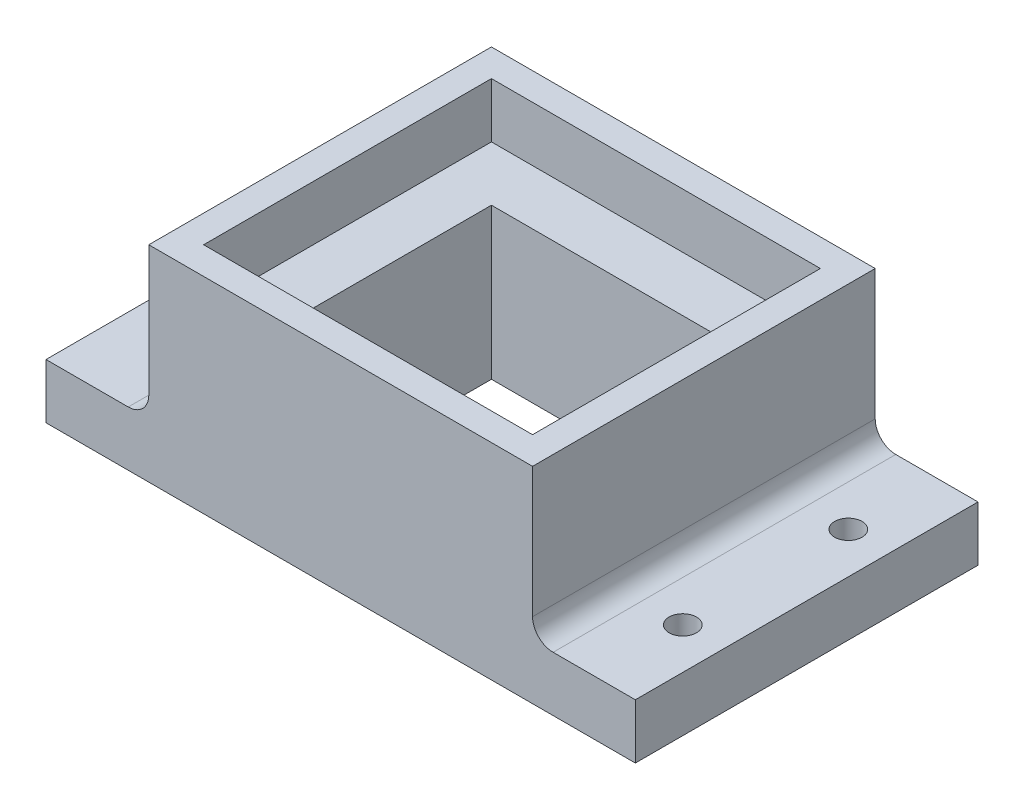
ISO-10303-21;
HEADER;
FILE_DESCRIPTION(('STEP AP214'),'2;1');
FILE_NAME('part.step','',(''),(''),'','','');
FILE_SCHEMA(('AUTOMOTIVE_DESIGN { 1 0 10303 214 1 1 1 1 }'));
ENDSEC;
DATA;
#1=APPLICATION_CONTEXT('core data for automotive mechanical design processes');
#2=APPLICATION_PROTOCOL_DEFINITION('international standard','automotive_design',2000,#1);
#3=PRODUCT_CONTEXT('',#1,'mechanical');
#4=PRODUCT('Part','Part','',(#3));
#5=PRODUCT_RELATED_PRODUCT_CATEGORY('part','',(#4));
#6=PRODUCT_DEFINITION_FORMATION('','',#4);
#7=PRODUCT_DEFINITION_CONTEXT('part definition',#1,'design');
#8=PRODUCT_DEFINITION('design','',#6,#7);
#9=PRODUCT_DEFINITION_SHAPE('','',#8);
#10=(LENGTH_UNIT() NAMED_UNIT(*) SI_UNIT(.MILLI.,.METRE.));
#11=(NAMED_UNIT(*) PLANE_ANGLE_UNIT() SI_UNIT($,.RADIAN.));
#12=(NAMED_UNIT(*) SI_UNIT($,.STERADIAN.) SOLID_ANGLE_UNIT());
#13=UNCERTAINTY_MEASURE_WITH_UNIT(LENGTH_MEASURE(1.E-05),#10,'distance_accuracy_value','');
#14=(GEOMETRIC_REPRESENTATION_CONTEXT(3) GLOBAL_UNCERTAINTY_ASSIGNED_CONTEXT((#13)) GLOBAL_UNIT_ASSIGNED_CONTEXT((#10,
#11,#12)) REPRESENTATION_CONTEXT('',''));
#15=CARTESIAN_POINT('',(0.,0.,0.));
#16=DIRECTION('',(0.,0.,1.));
#17=DIRECTION('',(1.,0.,0.));
#18=AXIS2_PLACEMENT_3D('',#15,#16,#17);
#19=CARTESIAN_POINT('',(28.,30.,25.));
#20=DIRECTION('',(-1.,0.,0.));
#21=DIRECTION('',(0.,0.,1.));
#22=AXIS2_PLACEMENT_3D('',#19,#20,#21);
#23=PLANE('',#22);
#24=DIRECTION('',(0.,-1.,0.));
#25=VECTOR('',#24,1.);
#26=CARTESIAN_POINT('',(28.,30.,25.));
#27=LINE('',#26,#25);
#28=CARTESIAN_POINT('',(28.,30.,25.));
#29=VERTEX_POINT('',#28);
#30=CARTESIAN_POINT('',(28.,11.,25.));
#31=VERTEX_POINT('',#30);
#32=EDGE_CURVE('E273',#29,#31,#27,.T.);
#33=ORIENTED_EDGE('',*,*,#32,.T.);
#34=DIRECTION('',(0.,0.,1.));
#35=VECTOR('',#34,1.);
#36=CARTESIAN_POINT('',(28.,11.,25.));
#37=LINE('',#36,#35);
#38=CARTESIAN_POINT('',(28.,11.,-25.));
#39=VERTEX_POINT('',#38);
#40=EDGE_CURVE('E290',#31,#39,#37,.F.);
#41=ORIENTED_EDGE('',*,*,#40,.T.);
#42=DIRECTION('',(0.,-1.,0.));
#43=VECTOR('',#42,1.);
#44=CARTESIAN_POINT('',(28.,30.,-25.));
#45=LINE('',#44,#43);
#46=CARTESIAN_POINT('',(28.,30.,-25.));
#47=VERTEX_POINT('',#46);
#48=EDGE_CURVE('E284',#47,#39,#45,.T.);
#49=ORIENTED_EDGE('',*,*,#48,.F.);
#50=DIRECTION('',(0.,0.,-1.));
#51=VECTOR('',#50,1.);
#52=CARTESIAN_POINT('',(28.,30.,25.));
#53=LINE('',#52,#51);
#54=EDGE_CURVE('E263',#29,#47,#53,.T.);
#55=ORIENTED_EDGE('',*,*,#54,.F.);
#56=EDGE_LOOP('',(#33,#41,#49,#55));
#57=FACE_BOUND('',#56,.T.);
#58=ADVANCED_FACE('F41',(#57),#23,.F.);
#59=CARTESIAN_POINT('',(-28.,30.,-25.));
#60=DIRECTION('',(0.,0.,1.));
#61=DIRECTION('',(1.,0.,0.));
#62=AXIS2_PLACEMENT_3D('',#59,#60,#61);
#63=PLANE('',#62);
#64=DIRECTION('',(-1.,0.,0.));
#65=VECTOR('',#64,1.);
#66=CARTESIAN_POINT('',(-28.,0.,-25.));
#67=LINE('',#66,#65);
#68=CARTESIAN_POINT('',(43.,0.,-25.));
#69=VERTEX_POINT('',#68);
#70=CARTESIAN_POINT('',(-43.,0.,-25.));
#71=VERTEX_POINT('',#70);
#72=EDGE_CURVE('E256',#69,#71,#67,.T.);
#73=ORIENTED_EDGE('',*,*,#72,.T.);
#74=DIRECTION('',(0.,1.,0.));
#75=VECTOR('',#74,1.);
#76=CARTESIAN_POINT('',(-43.,0.,-25.));
#77=LINE('',#76,#75);
#78=CARTESIAN_POINT('',(-43.,8.,-25.));
#79=VERTEX_POINT('',#78);
#80=EDGE_CURVE('E215',#71,#79,#77,.T.);
#81=ORIENTED_EDGE('',*,*,#80,.T.);
#82=DIRECTION('',(1.,0.,0.));
#83=VECTOR('',#82,1.);
#84=CARTESIAN_POINT('',(-28.,8.,-25.));
#85=LINE('',#84,#83);
#86=CARTESIAN_POINT('',(-31.,8.,-25.));
#87=VERTEX_POINT('',#86);
#88=EDGE_CURVE('E217',#79,#87,#85,.T.);
#89=ORIENTED_EDGE('',*,*,#88,.T.);
#90=CARTESIAN_POINT('',(-31.,11.,-25.));
#91=DIRECTION('',(0.,0.,1.));
#92=DIRECTION('',(1.,0.,0.));
#93=AXIS2_PLACEMENT_3D('',#90,#91,#92);
#94=CIRCLE('',#93,3.);
#95=CARTESIAN_POINT('',(-28.,11.,-25.));
#96=VERTEX_POINT('',#95);
#97=EDGE_CURVE('E303',#87,#96,#94,.T.);
#98=ORIENTED_EDGE('',*,*,#97,.T.);
#99=DIRECTION('',(0.,-1.,0.));
#100=VECTOR('',#99,1.);
#101=CARTESIAN_POINT('',(-28.,30.,-25.));
#102=LINE('',#101,#100);
#103=CARTESIAN_POINT('',(-28.,30.,-25.));
#104=VERTEX_POINT('',#103);
#105=EDGE_CURVE('E281',#104,#96,#102,.T.);
#106=ORIENTED_EDGE('',*,*,#105,.F.);
#107=DIRECTION('',(-1.,0.,0.));
#108=VECTOR('',#107,1.);
#109=CARTESIAN_POINT('',(-28.,30.,-25.));
#110=LINE('',#109,#108);
#111=EDGE_CURVE('E266',#47,#104,#110,.T.);
#112=ORIENTED_EDGE('',*,*,#111,.F.);
#113=ORIENTED_EDGE('',*,*,#48,.T.);
#114=CARTESIAN_POINT('',(31.,11.,-25.));
#115=DIRECTION('',(0.,0.,1.));
#116=DIRECTION('',(1.,0.,0.));
#117=AXIS2_PLACEMENT_3D('',#114,#115,#116);
#118=CIRCLE('',#117,3.);
#119=CARTESIAN_POINT('',(31.,8.00000000000001,-25.));
#120=VERTEX_POINT('',#119);
#121=EDGE_CURVE('E299',#39,#120,#118,.T.);
#122=ORIENTED_EDGE('',*,*,#121,.T.);
#123=DIRECTION('',(1.,0.,0.));
#124=VECTOR('',#123,1.);
#125=CARTESIAN_POINT('',(28.,8.00000000000001,-25.));
#126=LINE('',#125,#124);
#127=CARTESIAN_POINT('',(43.,8.00000000000001,-25.));
#128=VERTEX_POINT('',#127);
#129=EDGE_CURVE('E194',#120,#128,#126,.T.);
#130=ORIENTED_EDGE('',*,*,#129,.T.);
#131=DIRECTION('',(0.,-1.,0.));
#132=VECTOR('',#131,1.);
#133=CARTESIAN_POINT('',(43.,0.,-25.));
#134=LINE('',#133,#132);
#135=EDGE_CURVE('E205',#128,#69,#134,.T.);
#136=ORIENTED_EDGE('',*,*,#135,.T.);
#137=EDGE_LOOP('',(#73,#81,#89,#98,#106,#112,#113,#122,#130,#136));
#138=FACE_BOUND('',#137,.T.);
#139=ADVANCED_FACE('F326',(#138),#63,.F.);
#140=CARTESIAN_POINT('',(-28.,30.,25.));
#141=DIRECTION('',(1.,0.,0.));
#142=DIRECTION('',(0.,0.,-1.));
#143=AXIS2_PLACEMENT_3D('',#140,#141,#142);
#144=PLANE('',#143);
#145=ORIENTED_EDGE('',*,*,#105,.T.);
#146=DIRECTION('',(0.,0.,1.));
#147=VECTOR('',#146,1.);
#148=CARTESIAN_POINT('',(-28.,11.,25.));
#149=LINE('',#148,#147);
#150=CARTESIAN_POINT('',(-28.,11.,25.));
#151=VERTEX_POINT('',#150);
#152=EDGE_CURVE('E292',#96,#151,#149,.T.);
#153=ORIENTED_EDGE('',*,*,#152,.T.);
#154=DIRECTION('',(0.,-1.,0.));
#155=VECTOR('',#154,1.);
#156=CARTESIAN_POINT('',(-28.,30.,25.));
#157=LINE('',#156,#155);
#158=CARTESIAN_POINT('',(-28.,30.,25.));
#159=VERTEX_POINT('',#158);
#160=EDGE_CURVE('E278',#159,#151,#157,.T.);
#161=ORIENTED_EDGE('',*,*,#160,.F.);
#162=DIRECTION('',(0.,0.,1.));
#163=VECTOR('',#162,1.);
#164=CARTESIAN_POINT('',(-28.,30.,25.));
#165=LINE('',#164,#163);
#166=EDGE_CURVE('E269',#104,#159,#165,.T.);
#167=ORIENTED_EDGE('',*,*,#166,.F.);
#168=EDGE_LOOP('',(#145,#153,#161,#167));
#169=FACE_BOUND('',#168,.T.);
#170=ADVANCED_FACE('F332',(#169),#144,.F.);
#171=CARTESIAN_POINT('',(-28.,30.,25.));
#172=DIRECTION('',(0.,0.,-1.));
#173=DIRECTION('',(-1.,0.,0.));
#174=AXIS2_PLACEMENT_3D('',#171,#172,#173);
#175=PLANE('',#174);
#176=DIRECTION('',(1.,0.,0.));
#177=VECTOR('',#176,1.);
#178=CARTESIAN_POINT('',(-28.,0.,25.));
#179=LINE('',#178,#177);
#180=CARTESIAN_POINT('',(-43.,0.,25.));
#181=VERTEX_POINT('',#180);
#182=CARTESIAN_POINT('',(43.,0.,25.));
#183=VERTEX_POINT('',#182);
#184=EDGE_CURVE('E267',#181,#183,#179,.T.);
#185=ORIENTED_EDGE('',*,*,#184,.T.);
#186=DIRECTION('',(0.,1.,0.));
#187=VECTOR('',#186,1.);
#188=CARTESIAN_POINT('',(43.,0.,25.));
#189=LINE('',#188,#187);
#190=CARTESIAN_POINT('',(43.,8.00000000000001,25.));
#191=VERTEX_POINT('',#190);
#192=EDGE_CURVE('E208',#183,#191,#189,.T.);
#193=ORIENTED_EDGE('',*,*,#192,.T.);
#194=DIRECTION('',(-1.,0.,0.));
#195=VECTOR('',#194,1.);
#196=CARTESIAN_POINT('',(28.,8.00000000000001,25.));
#197=LINE('',#196,#195);
#198=CARTESIAN_POINT('',(31.,8.00000000000001,25.));
#199=VERTEX_POINT('',#198);
#200=EDGE_CURVE('E202',#191,#199,#197,.T.);
#201=ORIENTED_EDGE('',*,*,#200,.T.);
#202=CARTESIAN_POINT('',(31.,11.,25.));
#203=DIRECTION('',(0.,0.,-1.));
#204=DIRECTION('',(-1.,0.,0.));
#205=AXIS2_PLACEMENT_3D('',#202,#203,#204);
#206=CIRCLE('',#205,3.);
#207=EDGE_CURVE('E297',#199,#31,#206,.T.);
#208=ORIENTED_EDGE('',*,*,#207,.T.);
#209=ORIENTED_EDGE('',*,*,#32,.F.);
#210=DIRECTION('',(1.,0.,0.));
#211=VECTOR('',#210,1.);
#212=CARTESIAN_POINT('',(-28.,30.,25.));
#213=LINE('',#212,#211);
#214=EDGE_CURVE('E271',#159,#29,#213,.T.);
#215=ORIENTED_EDGE('',*,*,#214,.F.);
#216=ORIENTED_EDGE('',*,*,#160,.T.);
#217=CARTESIAN_POINT('',(-31.,11.,25.));
#218=DIRECTION('',(0.,0.,-1.));
#219=DIRECTION('',(-1.,0.,0.));
#220=AXIS2_PLACEMENT_3D('',#217,#218,#219);
#221=CIRCLE('',#220,3.);
#222=CARTESIAN_POINT('',(-31.,8.,25.));
#223=VERTEX_POINT('',#222);
#224=EDGE_CURVE('E301',#151,#223,#221,.T.);
#225=ORIENTED_EDGE('',*,*,#224,.T.);
#226=DIRECTION('',(-1.,0.,0.));
#227=VECTOR('',#226,1.);
#228=CARTESIAN_POINT('',(-28.,8.,25.));
#229=LINE('',#228,#227);
#230=CARTESIAN_POINT('',(-43.,8.,25.));
#231=VERTEX_POINT('',#230);
#232=EDGE_CURVE('E211',#223,#231,#229,.T.);
#233=ORIENTED_EDGE('',*,*,#232,.T.);
#234=DIRECTION('',(0.,-1.,0.));
#235=VECTOR('',#234,1.);
#236=CARTESIAN_POINT('',(-43.,0.,25.));
#237=LINE('',#236,#235);
#238=EDGE_CURVE('E220',#231,#181,#237,.T.);
#239=ORIENTED_EDGE('',*,*,#238,.T.);
#240=EDGE_LOOP('',(#185,#193,#201,#208,#209,#215,#216,#225,#233,#239));
#241=FACE_BOUND('',#240,.T.);
#242=ADVANCED_FACE('F360',(#241),#175,.F.);
#243=CARTESIAN_POINT('',(0.,30.,0.));
#244=DIRECTION('',(0.,-1.,0.));
#245=DIRECTION('',(0.,0.,-1.));
#246=AXIS2_PLACEMENT_3D('',#243,#244,#245);
#247=PLANE('',#246);
#248=DIRECTION('',(-1.,0.,0.));
#249=VECTOR('',#248,1.);
#250=CARTESIAN_POINT('',(-24.,30.,-21.));
#251=LINE('',#250,#249);
#252=CARTESIAN_POINT('',(24.,30.,-21.));
#253=VERTEX_POINT('',#252);
#254=CARTESIAN_POINT('',(-24.,30.,-21.));
#255=VERTEX_POINT('',#254);
#256=EDGE_CURVE('E246',#253,#255,#251,.T.);
#257=ORIENTED_EDGE('',*,*,#256,.F.);
#258=DIRECTION('',(0.,0.,-1.));
#259=VECTOR('',#258,1.);
#260=CARTESIAN_POINT('',(24.,30.,21.));
#261=LINE('',#260,#259);
#262=CARTESIAN_POINT('',(24.,30.,21.));
#263=VERTEX_POINT('',#262);
#264=EDGE_CURVE('E230',#263,#253,#261,.T.);
#265=ORIENTED_EDGE('',*,*,#264,.F.);
#266=DIRECTION('',(1.,0.,0.));
#267=VECTOR('',#266,1.);
#268=CARTESIAN_POINT('',(-24.,30.,21.));
#269=LINE('',#268,#267);
#270=CARTESIAN_POINT('',(-24.,30.,21.));
#271=VERTEX_POINT('',#270);
#272=EDGE_CURVE('E235',#271,#263,#269,.T.);
#273=ORIENTED_EDGE('',*,*,#272,.F.);
#274=DIRECTION('',(0.,0.,1.));
#275=VECTOR('',#274,1.);
#276=CARTESIAN_POINT('',(-24.,30.,21.));
#277=LINE('',#276,#275);
#278=EDGE_CURVE('E249',#255,#271,#277,.T.);
#279=ORIENTED_EDGE('',*,*,#278,.F.);
#280=EDGE_LOOP('',(#257,#265,#273,#279));
#281=FACE_BOUND('',#280,.T.);
#282=ORIENTED_EDGE('',*,*,#54,.T.);
#283=ORIENTED_EDGE('',*,*,#111,.T.);
#284=ORIENTED_EDGE('',*,*,#166,.T.);
#285=ORIENTED_EDGE('',*,*,#214,.T.);
#286=EDGE_LOOP('',(#282,#283,#284,#285));
#287=FACE_BOUND('',#286,.T.);
#288=ADVANCED_FACE('F382',(#281,#287),#247,.F.);
#289=CARTESIAN_POINT('',(0.,0.,0.));
#290=DIRECTION('',(0.,-1.,0.));
#291=DIRECTION('',(0.,0.,-1.));
#292=AXIS2_PLACEMENT_3D('',#289,#290,#291);
#293=PLANE('',#292);
#294=CARTESIAN_POINT('',(37.,0.,-12.0793859622358));
#295=DIRECTION('',(0.,1.,0.));
#296=DIRECTION('',(1.,0.,0.));
#297=AXIS2_PLACEMENT_3D('',#294,#295,#296);
#298=CIRCLE('',#297,2.);
#299=CARTESIAN_POINT('',(39.,0.,-12.0793859622358));
#300=VERTEX_POINT('',#299);
#301=EDGE_CURVE('E675',#300,#300,#298,.T.);
#302=ORIENTED_EDGE('',*,*,#301,.T.);
#303=EDGE_LOOP('',(#302));
#304=FACE_BOUND('',#303,.T.);
#305=CARTESIAN_POINT('',(37.,0.,12.0793859622358));
#306=DIRECTION('',(0.,1.,0.));
#307=DIRECTION('',(1.,0.,0.));
#308=AXIS2_PLACEMENT_3D('',#305,#306,#307);
#309=CIRCLE('',#308,2.);
#310=CARTESIAN_POINT('',(39.,0.,12.0793859622358));
#311=VERTEX_POINT('',#310);
#312=EDGE_CURVE('E669',#311,#311,#309,.T.);
#313=ORIENTED_EDGE('',*,*,#312,.T.);
#314=EDGE_LOOP('',(#313));
#315=FACE_BOUND('',#314,.T.);
#316=CARTESIAN_POINT('',(-37.,0.,12.0793859622358));
#317=DIRECTION('',(0.,1.,0.));
#318=DIRECTION('',(-1.,0.,0.));
#319=AXIS2_PLACEMENT_3D('',#316,#317,#318);
#320=CIRCLE('',#319,2.);
#321=CARTESIAN_POINT('',(-39.,0.,12.0793859622358));
#322=VERTEX_POINT('',#321);
#323=EDGE_CURVE('E658',#322,#322,#320,.T.);
#324=ORIENTED_EDGE('',*,*,#323,.T.);
#325=EDGE_LOOP('',(#324));
#326=FACE_BOUND('',#325,.T.);
#327=CARTESIAN_POINT('',(-37.,0.,-12.0793859622358));
#328=DIRECTION('',(0.,1.,0.));
#329=DIRECTION('',(-1.,0.,0.));
#330=AXIS2_PLACEMENT_3D('',#327,#328,#329);
#331=CIRCLE('',#330,2.);
#332=CARTESIAN_POINT('',(-39.,0.,-12.0793859622358));
#333=VERTEX_POINT('',#332);
#334=EDGE_CURVE('E183',#333,#333,#331,.T.);
#335=ORIENTED_EDGE('',*,*,#334,.T.);
#336=EDGE_LOOP('',(#335));
#337=FACE_BOUND('',#336,.T.);
#338=DIRECTION('',(0.,0.,-1.));
#339=VECTOR('',#338,1.);
#340=CARTESIAN_POINT('',(16.,0.,13.));
#341=LINE('',#340,#339);
#342=CARTESIAN_POINT('',(16.,0.,13.));
#343=VERTEX_POINT('',#342);
#344=CARTESIAN_POINT('',(16.,0.,-13.));
#345=VERTEX_POINT('',#344);
#346=EDGE_CURVE('E169',#343,#345,#341,.T.);
#347=ORIENTED_EDGE('',*,*,#346,.T.);
#348=DIRECTION('',(-1.,0.,0.));
#349=VECTOR('',#348,1.);
#350=CARTESIAN_POINT('',(-16.,0.,-13.));
#351=LINE('',#350,#349);
#352=CARTESIAN_POINT('',(-16.,0.,-13.));
#353=VERTEX_POINT('',#352);
#354=EDGE_CURVE('E176',#345,#353,#351,.T.);
#355=ORIENTED_EDGE('',*,*,#354,.T.);
#356=DIRECTION('',(0.,0.,1.));
#357=VECTOR('',#356,1.);
#358=CARTESIAN_POINT('',(-16.,0.,13.));
#359=LINE('',#358,#357);
#360=CARTESIAN_POINT('',(-16.,0.,13.));
#361=VERTEX_POINT('',#360);
#362=EDGE_CURVE('E56',#353,#361,#359,.T.);
#363=ORIENTED_EDGE('',*,*,#362,.T.);
#364=DIRECTION('',(1.,0.,0.));
#365=VECTOR('',#364,1.);
#366=CARTESIAN_POINT('',(-16.,0.,13.));
#367=LINE('',#366,#365);
#368=EDGE_CURVE('E173',#361,#343,#367,.T.);
#369=ORIENTED_EDGE('',*,*,#368,.T.);
#370=EDGE_LOOP('',(#347,#355,#363,#369));
#371=FACE_BOUND('',#370,.T.);
#372=ORIENTED_EDGE('',*,*,#72,.F.);
#373=DIRECTION('',(0.,0.,1.));
#374=VECTOR('',#373,1.);
#375=CARTESIAN_POINT('',(43.,0.,-42.));
#376=LINE('',#375,#374);
#377=EDGE_CURVE('E199',#69,#183,#376,.T.);
#378=ORIENTED_EDGE('',*,*,#377,.T.);
#379=ORIENTED_EDGE('',*,*,#184,.F.);
#380=DIRECTION('',(0.,0.,1.));
#381=VECTOR('',#380,1.);
#382=CARTESIAN_POINT('',(-43.,0.,-42.));
#383=LINE('',#382,#381);
#384=EDGE_CURVE('E218',#71,#181,#383,.T.);
#385=ORIENTED_EDGE('',*,*,#384,.F.);
#386=EDGE_LOOP('',(#372,#378,#379,#385));
#387=FACE_BOUND('',#386,.T.);
#388=ADVANCED_FACE('F180',(#304,#315,#326,#337,#371,#387),#293,.T.);
#389=CARTESIAN_POINT('',(24.,22.,21.));
#390=DIRECTION('',(1.,0.,0.));
#391=DIRECTION('',(0.,0.,-1.));
#392=AXIS2_PLACEMENT_3D('',#389,#390,#391);
#393=PLANE('',#392);
#394=ORIENTED_EDGE('',*,*,#264,.T.);
#395=DIRECTION('',(0.,1.,0.));
#396=VECTOR('',#395,1.);
#397=CARTESIAN_POINT('',(24.,22.,-21.));
#398=LINE('',#397,#396);
#399=CARTESIAN_POINT('',(24.,22.,-21.));
#400=VERTEX_POINT('',#399);
#401=EDGE_CURVE('E244',#400,#253,#398,.T.);
#402=ORIENTED_EDGE('',*,*,#401,.F.);
#403=DIRECTION('',(0.,0.,-1.));
#404=VECTOR('',#403,1.);
#405=CARTESIAN_POINT('',(24.,22.,21.));
#406=LINE('',#405,#404);
#407=CARTESIAN_POINT('',(24.,22.,21.));
#408=VERTEX_POINT('',#407);
#409=EDGE_CURVE('E231',#408,#400,#406,.T.);
#410=ORIENTED_EDGE('',*,*,#409,.F.);
#411=DIRECTION('',(0.,1.,0.));
#412=VECTOR('',#411,1.);
#413=CARTESIAN_POINT('',(24.,22.,21.));
#414=LINE('',#413,#412);
#415=EDGE_CURVE('E254',#408,#263,#414,.T.);
#416=ORIENTED_EDGE('',*,*,#415,.T.);
#417=EDGE_LOOP('',(#394,#402,#410,#416));
#418=FACE_BOUND('',#417,.T.);
#419=ADVANCED_FACE('F390',(#418),#393,.F.);
#420=CARTESIAN_POINT('',(-24.,22.,21.));
#421=DIRECTION('',(0.,0.,1.));
#422=DIRECTION('',(1.,0.,0.));
#423=AXIS2_PLACEMENT_3D('',#420,#421,#422);
#424=PLANE('',#423);
#425=ORIENTED_EDGE('',*,*,#272,.T.);
#426=ORIENTED_EDGE('',*,*,#415,.F.);
#427=DIRECTION('',(1.,0.,0.));
#428=VECTOR('',#427,1.);
#429=CARTESIAN_POINT('',(-24.,22.,21.));
#430=LINE('',#429,#428);
#431=CARTESIAN_POINT('',(-24.,22.,21.));
#432=VERTEX_POINT('',#431);
#433=EDGE_CURVE('E241',#432,#408,#430,.T.);
#434=ORIENTED_EDGE('',*,*,#433,.F.);
#435=DIRECTION('',(0.,1.,0.));
#436=VECTOR('',#435,1.);
#437=CARTESIAN_POINT('',(-24.,22.,21.));
#438=LINE('',#437,#436);
#439=EDGE_CURVE('E257',#432,#271,#438,.T.);
#440=ORIENTED_EDGE('',*,*,#439,.T.);
#441=EDGE_LOOP('',(#425,#426,#434,#440));
#442=FACE_BOUND('',#441,.T.);
#443=ADVANCED_FACE('F580',(#442),#424,.F.);
#444=CARTESIAN_POINT('',(-24.,22.,21.));
#445=DIRECTION('',(-1.,0.,0.));
#446=DIRECTION('',(0.,0.,1.));
#447=AXIS2_PLACEMENT_3D('',#444,#445,#446);
#448=PLANE('',#447);
#449=ORIENTED_EDGE('',*,*,#278,.T.);
#450=ORIENTED_EDGE('',*,*,#439,.F.);
#451=DIRECTION('',(0.,0.,1.));
#452=VECTOR('',#451,1.);
#453=CARTESIAN_POINT('',(-24.,22.,21.));
#454=LINE('',#453,#452);
#455=CARTESIAN_POINT('',(-24.,22.,-21.));
#456=VERTEX_POINT('',#455);
#457=EDGE_CURVE('E238',#456,#432,#454,.T.);
#458=ORIENTED_EDGE('',*,*,#457,.F.);
#459=DIRECTION('',(0.,1.,0.));
#460=VECTOR('',#459,1.);
#461=CARTESIAN_POINT('',(-24.,22.,-21.));
#462=LINE('',#461,#460);
#463=EDGE_CURVE('E259',#456,#255,#462,.T.);
#464=ORIENTED_EDGE('',*,*,#463,.T.);
#465=EDGE_LOOP('',(#449,#450,#458,#464));
#466=FACE_BOUND('',#465,.T.);
#467=ADVANCED_FACE('F571',(#466),#448,.F.);
#468=CARTESIAN_POINT('',(-24.,22.,-21.));
#469=DIRECTION('',(0.,0.,-1.));
#470=DIRECTION('',(-1.,0.,0.));
#471=AXIS2_PLACEMENT_3D('',#468,#469,#470);
#472=PLANE('',#471);
#473=ORIENTED_EDGE('',*,*,#256,.T.);
#474=ORIENTED_EDGE('',*,*,#463,.F.);
#475=DIRECTION('',(-1.,0.,0.));
#476=VECTOR('',#475,1.);
#477=CARTESIAN_POINT('',(-24.,22.,-21.));
#478=LINE('',#477,#476);
#479=EDGE_CURVE('E234',#400,#456,#478,.T.);
#480=ORIENTED_EDGE('',*,*,#479,.F.);
#481=ORIENTED_EDGE('',*,*,#401,.T.);
#482=EDGE_LOOP('',(#473,#474,#480,#481));
#483=FACE_BOUND('',#482,.T.);
#484=ADVANCED_FACE('F432',(#483),#472,.F.);
#485=CARTESIAN_POINT('',(0.,22.,0.));
#486=DIRECTION('',(0.,-1.,0.));
#487=DIRECTION('',(0.,0.,-1.));
#488=AXIS2_PLACEMENT_3D('',#485,#486,#487);
#489=PLANE('',#488);
#490=DIRECTION('',(1.,0.,0.));
#491=VECTOR('',#490,1.);
#492=CARTESIAN_POINT('',(0.,22.,-13.));
#493=LINE('',#492,#491);
#494=CARTESIAN_POINT('',(-16.,22.,-13.));
#495=VERTEX_POINT('',#494);
#496=CARTESIAN_POINT('',(16.,22.,-13.));
#497=VERTEX_POINT('',#496);
#498=EDGE_CURVE('E305',#495,#497,#493,.T.);
#499=ORIENTED_EDGE('',*,*,#498,.T.);
#500=DIRECTION('',(0.,0.,1.));
#501=VECTOR('',#500,1.);
#502=CARTESIAN_POINT('',(16.,22.,0.));
#503=LINE('',#502,#501);
#504=CARTESIAN_POINT('',(16.,22.,13.));
#505=VERTEX_POINT('',#504);
#506=EDGE_CURVE('E11',#497,#505,#503,.T.);
#507=ORIENTED_EDGE('',*,*,#506,.T.);
#508=DIRECTION('',(-1.,0.,0.));
#509=VECTOR('',#508,1.);
#510=CARTESIAN_POINT('',(0.,22.,13.));
#511=LINE('',#510,#509);
#512=CARTESIAN_POINT('',(-16.,22.,13.));
#513=VERTEX_POINT('',#512);
#514=EDGE_CURVE('E49',#505,#513,#511,.T.);
#515=ORIENTED_EDGE('',*,*,#514,.T.);
#516=DIRECTION('',(0.,0.,-1.));
#517=VECTOR('',#516,1.);
#518=CARTESIAN_POINT('',(-16.,22.,0.));
#519=LINE('',#518,#517);
#520=EDGE_CURVE('E307',#513,#495,#519,.T.);
#521=ORIENTED_EDGE('',*,*,#520,.T.);
#522=EDGE_LOOP('',(#499,#507,#515,#521));
#523=FACE_BOUND('',#522,.T.);
#524=ORIENTED_EDGE('',*,*,#409,.T.);
#525=ORIENTED_EDGE('',*,*,#479,.T.);
#526=ORIENTED_EDGE('',*,*,#457,.T.);
#527=ORIENTED_EDGE('',*,*,#433,.T.);
#528=EDGE_LOOP('',(#524,#525,#526,#527));
#529=FACE_BOUND('',#528,.T.);
#530=ADVANCED_FACE('F311',(#523,#529),#489,.F.);
#531=CARTESIAN_POINT('',(-43.,0.,-42.));
#532=DIRECTION('',(-1.,0.,0.));
#533=DIRECTION('',(0.,0.,1.));
#534=AXIS2_PLACEMENT_3D('',#531,#532,#533);
#535=PLANE('',#534);
#536=ORIENTED_EDGE('',*,*,#80,.F.);
#537=ORIENTED_EDGE('',*,*,#384,.T.);
#538=ORIENTED_EDGE('',*,*,#238,.F.);
#539=DIRECTION('',(0.,0.,1.));
#540=VECTOR('',#539,1.);
#541=CARTESIAN_POINT('',(-43.,8.,-42.));
#542=LINE('',#541,#540);
#543=EDGE_CURVE('E223',#79,#231,#542,.T.);
#544=ORIENTED_EDGE('',*,*,#543,.F.);
#545=EDGE_LOOP('',(#536,#537,#538,#544));
#546=FACE_BOUND('',#545,.T.);
#547=ADVANCED_FACE('F366',(#546),#535,.T.);
#548=CARTESIAN_POINT('',(-28.,8.,-42.));
#549=DIRECTION('',(0.,1.,0.));
#550=DIRECTION('',(-1.,0.,0.));
#551=AXIS2_PLACEMENT_3D('',#548,#549,#550);
#552=PLANE('',#551);
#553=CARTESIAN_POINT('',(-37.,8.,12.0793859622358));
#554=DIRECTION('',(0.,1.,0.));
#555=DIRECTION('',(-1.,0.,0.));
#556=AXIS2_PLACEMENT_3D('',#553,#554,#555);
#557=CIRCLE('',#556,2.);
#558=CARTESIAN_POINT('',(-39.,8.,12.0793859622358));
#559=VERTEX_POINT('',#558);
#560=EDGE_CURVE('E661',#559,#559,#557,.T.);
#561=ORIENTED_EDGE('',*,*,#560,.F.);
#562=EDGE_LOOP('',(#561));
#563=FACE_BOUND('',#562,.T.);
#564=CARTESIAN_POINT('',(-37.,8.,-12.0793859622358));
#565=DIRECTION('',(0.,1.,0.));
#566=DIRECTION('',(-1.,0.,0.));
#567=AXIS2_PLACEMENT_3D('',#564,#565,#566);
#568=CIRCLE('',#567,2.);
#569=CARTESIAN_POINT('',(-39.,8.,-12.0793859622358));
#570=VERTEX_POINT('',#569);
#571=EDGE_CURVE('E186',#570,#570,#568,.T.);
#572=ORIENTED_EDGE('',*,*,#571,.F.);
#573=EDGE_LOOP('',(#572));
#574=FACE_BOUND('',#573,.T.);
#575=ORIENTED_EDGE('',*,*,#232,.F.);
#576=DIRECTION('',(0.,0.,1.));
#577=VECTOR('',#576,1.);
#578=CARTESIAN_POINT('',(-31.,8.,-42.));
#579=LINE('',#578,#577);
#580=EDGE_CURVE('E295',#223,#87,#579,.F.);
#581=ORIENTED_EDGE('',*,*,#580,.T.);
#582=ORIENTED_EDGE('',*,*,#88,.F.);
#583=ORIENTED_EDGE('',*,*,#543,.T.);
#584=EDGE_LOOP('',(#575,#581,#582,#583));
#585=FACE_BOUND('',#584,.T.);
#586=ADVANCED_FACE('F370',(#563,#574,#585),#552,.T.);
#587=CARTESIAN_POINT('',(28.,8.00000000000001,-42.));
#588=DIRECTION('',(0.,1.,0.));
#589=DIRECTION('',(0.,0.,1.));
#590=AXIS2_PLACEMENT_3D('',#587,#588,#589);
#591=PLANE('',#590);
#592=CARTESIAN_POINT('',(37.,8.00000000000001,-12.0793859622358));
#593=DIRECTION('',(0.,1.,0.));
#594=DIRECTION('',(1.,0.,0.));
#595=AXIS2_PLACEMENT_3D('',#592,#593,#594);
#596=CIRCLE('',#595,2.);
#597=CARTESIAN_POINT('',(39.,8.00000000000001,-12.0793859622358));
#598=VERTEX_POINT('',#597);
#599=EDGE_CURVE('E672',#598,#598,#596,.T.);
#600=ORIENTED_EDGE('',*,*,#599,.F.);
#601=EDGE_LOOP('',(#600));
#602=FACE_BOUND('',#601,.T.);
#603=CARTESIAN_POINT('',(37.,8.00000000000001,12.0793859622358));
#604=DIRECTION('',(0.,1.,0.));
#605=DIRECTION('',(1.,0.,0.));
#606=AXIS2_PLACEMENT_3D('',#603,#604,#605);
#607=CIRCLE('',#606,2.);
#608=CARTESIAN_POINT('',(39.,8.00000000000001,12.0793859622358));
#609=VERTEX_POINT('',#608);
#610=EDGE_CURVE('E664',#609,#609,#607,.T.);
#611=ORIENTED_EDGE('',*,*,#610,.F.);
#612=EDGE_LOOP('',(#611));
#613=FACE_BOUND('',#612,.T.);
#614=ORIENTED_EDGE('',*,*,#129,.F.);
#615=DIRECTION('',(0.,0.,1.));
#616=VECTOR('',#615,1.);
#617=CARTESIAN_POINT('',(31.,8.00000000000001,-42.));
#618=LINE('',#617,#616);
#619=EDGE_CURVE('E287',#120,#199,#618,.T.);
#620=ORIENTED_EDGE('',*,*,#619,.T.);
#621=ORIENTED_EDGE('',*,*,#200,.F.);
#622=DIRECTION('',(0.,0.,1.));
#623=VECTOR('',#622,1.);
#624=CARTESIAN_POINT('',(43.,8.00000000000001,-42.));
#625=LINE('',#624,#623);
#626=EDGE_CURVE('E203',#128,#191,#625,.T.);
#627=ORIENTED_EDGE('',*,*,#626,.F.);
#628=EDGE_LOOP('',(#614,#620,#621,#627));
#629=FACE_BOUND('',#628,.T.);
#630=ADVANCED_FACE('F345',(#602,#613,#629),#591,.T.);
#631=CARTESIAN_POINT('',(43.,0.,-42.));
#632=DIRECTION('',(1.,0.,0.));
#633=DIRECTION('',(0.,0.,-1.));
#634=AXIS2_PLACEMENT_3D('',#631,#632,#633);
#635=PLANE('',#634);
#636=ORIENTED_EDGE('',*,*,#135,.F.);
#637=ORIENTED_EDGE('',*,*,#626,.T.);
#638=ORIENTED_EDGE('',*,*,#192,.F.);
#639=ORIENTED_EDGE('',*,*,#377,.F.);
#640=EDGE_LOOP('',(#636,#637,#638,#639));
#641=FACE_BOUND('',#640,.T.);
#642=ADVANCED_FACE('F338',(#641),#635,.T.);
#643=CARTESIAN_POINT('',(31.,11.,-42.));
#644=DIRECTION('',(0.,0.,1.));
#645=DIRECTION('',(1.,0.,0.));
#646=AXIS2_PLACEMENT_3D('',#643,#644,#645);
#647=CYLINDRICAL_SURFACE('',#646,3.);
#648=ORIENTED_EDGE('',*,*,#121,.F.);
#649=ORIENTED_EDGE('',*,*,#40,.F.);
#650=ORIENTED_EDGE('',*,*,#207,.F.);
#651=ORIENTED_EDGE('',*,*,#619,.F.);
#652=EDGE_LOOP('',(#648,#649,#650,#651));
#653=FACE_BOUND('',#652,.T.);
#654=ADVANCED_FACE('F336',(#653),#647,.F.);
#655=CARTESIAN_POINT('',(-31.,11.,25.));
#656=DIRECTION('',(0.,0.,1.));
#657=DIRECTION('',(1.,0.,0.));
#658=AXIS2_PLACEMENT_3D('',#655,#656,#657);
#659=CYLINDRICAL_SURFACE('',#658,3.);
#660=ORIENTED_EDGE('',*,*,#97,.F.);
#661=ORIENTED_EDGE('',*,*,#580,.F.);
#662=ORIENTED_EDGE('',*,*,#224,.F.);
#663=ORIENTED_EDGE('',*,*,#152,.F.);
#664=EDGE_LOOP('',(#660,#661,#662,#663));
#665=FACE_BOUND('',#664,.T.);
#666=ADVANCED_FACE('F43',(#665),#659,.F.);
#667=CARTESIAN_POINT('',(16.,0.,13.));
#668=DIRECTION('',(1.,0.,0.));
#669=DIRECTION('',(0.,0.,-1.));
#670=AXIS2_PLACEMENT_3D('',#667,#668,#669);
#671=PLANE('',#670);
#672=DIRECTION('',(0.,1.,0.));
#673=VECTOR('',#672,1.);
#674=CARTESIAN_POINT('',(16.,0.,-13.));
#675=LINE('',#674,#673);
#676=EDGE_CURVE('E64',#345,#497,#675,.T.);
#677=ORIENTED_EDGE('',*,*,#676,.F.);
#678=ORIENTED_EDGE('',*,*,#346,.F.);
#679=DIRECTION('',(0.,1.,0.));
#680=VECTOR('',#679,1.);
#681=CARTESIAN_POINT('',(16.,0.,13.));
#682=LINE('',#681,#680);
#683=EDGE_CURVE('E192',#343,#505,#682,.T.);
#684=ORIENTED_EDGE('',*,*,#683,.T.);
#685=ORIENTED_EDGE('',*,*,#506,.F.);
#686=EDGE_LOOP('',(#677,#678,#684,#685));
#687=FACE_BOUND('',#686,.T.);
#688=ADVANCED_FACE('F166',(#687),#671,.F.);
#689=CARTESIAN_POINT('',(-16.,0.,13.));
#690=DIRECTION('',(0.,0.,1.));
#691=DIRECTION('',(1.,0.,0.));
#692=AXIS2_PLACEMENT_3D('',#689,#690,#691);
#693=PLANE('',#692);
#694=ORIENTED_EDGE('',*,*,#683,.F.);
#695=ORIENTED_EDGE('',*,*,#368,.F.);
#696=DIRECTION('',(0.,1.,0.));
#697=VECTOR('',#696,1.);
#698=CARTESIAN_POINT('',(-16.,0.,13.));
#699=LINE('',#698,#697);
#700=EDGE_CURVE('E195',#361,#513,#699,.T.);
#701=ORIENTED_EDGE('',*,*,#700,.T.);
#702=ORIENTED_EDGE('',*,*,#514,.F.);
#703=EDGE_LOOP('',(#694,#695,#701,#702));
#704=FACE_BOUND('',#703,.T.);
#705=ADVANCED_FACE('F314',(#704),#693,.F.);
#706=CARTESIAN_POINT('',(-16.,0.,13.));
#707=DIRECTION('',(-1.,0.,0.));
#708=DIRECTION('',(0.,0.,1.));
#709=AXIS2_PLACEMENT_3D('',#706,#707,#708);
#710=PLANE('',#709);
#711=ORIENTED_EDGE('',*,*,#700,.F.);
#712=ORIENTED_EDGE('',*,*,#362,.F.);
#713=DIRECTION('',(0.,1.,0.));
#714=VECTOR('',#713,1.);
#715=CARTESIAN_POINT('',(-16.,0.,-13.));
#716=LINE('',#715,#714);
#717=EDGE_CURVE('E172',#353,#495,#716,.T.);
#718=ORIENTED_EDGE('',*,*,#717,.T.);
#719=ORIENTED_EDGE('',*,*,#520,.F.);
#720=EDGE_LOOP('',(#711,#712,#718,#719));
#721=FACE_BOUND('',#720,.T.);
#722=ADVANCED_FACE('F315',(#721),#710,.F.);
#723=CARTESIAN_POINT('',(-16.,0.,-13.));
#724=DIRECTION('',(0.,0.,-1.));
#725=DIRECTION('',(-1.,0.,0.));
#726=AXIS2_PLACEMENT_3D('',#723,#724,#725);
#727=PLANE('',#726);
#728=ORIENTED_EDGE('',*,*,#717,.F.);
#729=ORIENTED_EDGE('',*,*,#354,.F.);
#730=ORIENTED_EDGE('',*,*,#676,.T.);
#731=ORIENTED_EDGE('',*,*,#498,.F.);
#732=EDGE_LOOP('',(#728,#729,#730,#731));
#733=FACE_BOUND('',#732,.T.);
#734=ADVANCED_FACE('F177',(#733),#727,.F.);
#735=CARTESIAN_POINT('',(37.,0.,12.0793859622358));
#736=DIRECTION('',(0.,1.,0.));
#737=DIRECTION('',(-1.,0.,0.));
#738=AXIS2_PLACEMENT_3D('',#735,#736,#737);
#739=CYLINDRICAL_SURFACE('',#738,2.);
#740=ORIENTED_EDGE('',*,*,#312,.F.);
#741=EDGE_LOOP('',(#740));
#742=FACE_BOUND('',#741,.T.);
#743=ORIENTED_EDGE('',*,*,#610,.T.);
#744=EDGE_LOOP('',(#743));
#745=FACE_BOUND('',#744,.T.);
#746=ADVANCED_FACE('F322',(#742,#745),#739,.F.);
#747=CARTESIAN_POINT('',(37.,0.,-12.0793859622358));
#748=DIRECTION('',(0.,1.,0.));
#749=DIRECTION('',(-1.,0.,0.));
#750=AXIS2_PLACEMENT_3D('',#747,#748,#749);
#751=CYLINDRICAL_SURFACE('',#750,2.);
#752=ORIENTED_EDGE('',*,*,#301,.F.);
#753=EDGE_LOOP('',(#752));
#754=FACE_BOUND('',#753,.T.);
#755=ORIENTED_EDGE('',*,*,#599,.T.);
#756=EDGE_LOOP('',(#755));
#757=FACE_BOUND('',#756,.T.);
#758=ADVANCED_FACE('F500',(#754,#757),#751,.F.);
#759=CARTESIAN_POINT('',(-37.,0.,-12.0793859622358));
#760=DIRECTION('',(0.,1.,0.));
#761=DIRECTION('',(-1.,0.,0.));
#762=AXIS2_PLACEMENT_3D('',#759,#760,#761);
#763=CYLINDRICAL_SURFACE('',#762,2.);
#764=ORIENTED_EDGE('',*,*,#334,.F.);
#765=EDGE_LOOP('',(#764));
#766=FACE_BOUND('',#765,.T.);
#767=ORIENTED_EDGE('',*,*,#571,.T.);
#768=EDGE_LOOP('',(#767));
#769=FACE_BOUND('',#768,.T.);
#770=ADVANCED_FACE('F511',(#766,#769),#763,.F.);
#771=CARTESIAN_POINT('',(-37.,0.,12.0793859622358));
#772=DIRECTION('',(0.,1.,0.));
#773=DIRECTION('',(-1.,0.,0.));
#774=AXIS2_PLACEMENT_3D('',#771,#772,#773);
#775=CYLINDRICAL_SURFACE('',#774,2.);
#776=ORIENTED_EDGE('',*,*,#323,.F.);
#777=EDGE_LOOP('',(#776));
#778=FACE_BOUND('',#777,.T.);
#779=ORIENTED_EDGE('',*,*,#560,.T.);
#780=EDGE_LOOP('',(#779));
#781=FACE_BOUND('',#780,.T.);
#782=ADVANCED_FACE('F522',(#778,#781),#775,.F.);
#783=CLOSED_SHELL('',(#58,#139,#170,#242,#288,#388,#419,#443,#467,#484,#530,#547,#586,#630,#642,
#654,#666,#688,#705,#722,#734,#746,#758,#770,#782));
#784=MANIFOLD_SOLID_BREP('B2',#783);
#785=ADVANCED_BREP_SHAPE_REPRESENTATION('',(#18,#784),#14);
#786=SHAPE_DEFINITION_REPRESENTATION(#9,#785);
ENDSEC;
END-ISO-10303-21;
